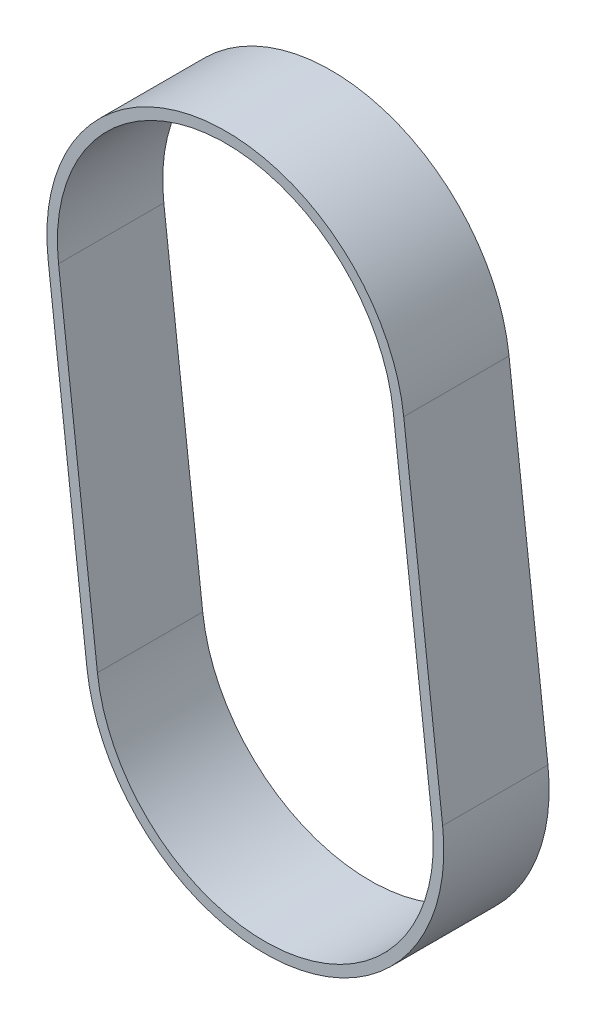
ISO-10303-21;
HEADER;
FILE_DESCRIPTION(('STEP AP214'),'2;1');
FILE_NAME('part.step','',(''),(''),'','','');
FILE_SCHEMA(('AUTOMOTIVE_DESIGN { 1 0 10303 214 1 1 1 1 }'));
ENDSEC;
DATA;
#1=APPLICATION_CONTEXT('core data for automotive mechanical design processes');
#2=APPLICATION_PROTOCOL_DEFINITION('international standard','automotive_design',2000,#1);
#3=PRODUCT_CONTEXT('',#1,'mechanical');
#4=PRODUCT('Part','Part','',(#3));
#5=PRODUCT_RELATED_PRODUCT_CATEGORY('part','',(#4));
#6=PRODUCT_DEFINITION_FORMATION('','',#4);
#7=PRODUCT_DEFINITION_CONTEXT('part definition',#1,'design');
#8=PRODUCT_DEFINITION('design','',#6,#7);
#9=PRODUCT_DEFINITION_SHAPE('','',#8);
#10=(LENGTH_UNIT() NAMED_UNIT(*) SI_UNIT(.MILLI.,.METRE.));
#11=(NAMED_UNIT(*) PLANE_ANGLE_UNIT() SI_UNIT($,.RADIAN.));
#12=(NAMED_UNIT(*) SI_UNIT($,.STERADIAN.) SOLID_ANGLE_UNIT());
#13=UNCERTAINTY_MEASURE_WITH_UNIT(LENGTH_MEASURE(1.E-05),#10,'distance_accuracy_value','');
#14=(GEOMETRIC_REPRESENTATION_CONTEXT(3) GLOBAL_UNCERTAINTY_ASSIGNED_CONTEXT((#13)) GLOBAL_UNIT_ASSIGNED_CONTEXT((#10,
#11,#12)) REPRESENTATION_CONTEXT('',''));
#15=CARTESIAN_POINT('',(0.,0.,0.));
#16=DIRECTION('',(0.,0.,1.));
#17=DIRECTION('',(1.,0.,0.));
#18=AXIS2_PLACEMENT_3D('',#15,#16,#17);
#19=CARTESIAN_POINT('',(550.233603989508,25.6899886030883,219.190394221551));
#20=DIRECTION('',(0.,0.,-1.));
#21=DIRECTION('',(0.993314481568456,0.115439770904089,0.));
#22=AXIS2_PLACEMENT_3D('',#19,#20,#21);
#23=PLANE('',#22);
#24=CARTESIAN_POINT('',(550.233603989508,25.6899886030883,219.190394221551));
#25=DIRECTION('',(0.,0.,-1.));
#26=DIRECTION('',(0.993314481568456,0.115439770904089,0.));
#27=AXIS2_PLACEMENT_3D('',#24,#25,#26);
#28=CIRCLE('',#27,17.);
#29=CARTESIAN_POINT('',(567.119950176171,27.6524647084578,219.190394221551));
#30=VERTEX_POINT('',#29);
#31=CARTESIAN_POINT('',(533.347257802844,23.7275124977188,219.190394221551));
#32=VERTEX_POINT('',#31);
#33=EDGE_CURVE('E141',#30,#32,#28,.T.);
#34=ORIENTED_EDGE('',*,*,#33,.T.);
#35=DIRECTION('',(-0.115439770904089,0.993314481568456,0.));
#36=VECTOR('',#35,1.);
#37=CARTESIAN_POINT('',(533.347257802844,23.7275124977188,219.190394221551));
#38=LINE('',#37,#36);
#39=CARTESIAN_POINT('',(529.653185133913,55.5135759079094,219.190394221551));
#40=VERTEX_POINT('',#39);
#41=EDGE_CURVE('E144',#32,#40,#38,.T.);
#42=ORIENTED_EDGE('',*,*,#41,.T.);
#43=CARTESIAN_POINT('',(546.539531320577,57.4760520132789,219.190394221551));
#44=DIRECTION('',(0.,0.,-1.));
#45=DIRECTION('',(0.993314481568456,0.115439770904089,0.));
#46=AXIS2_PLACEMENT_3D('',#43,#44,#45);
#47=CIRCLE('',#46,17.);
#48=CARTESIAN_POINT('',(563.425877507241,59.4385281186484,219.190394221551));
#49=VERTEX_POINT('',#48);
#50=EDGE_CURVE('E147',#40,#49,#47,.T.);
#51=ORIENTED_EDGE('',*,*,#50,.T.);
#52=DIRECTION('',(0.115439770904089,-0.993314481568456,0.));
#53=VECTOR('',#52,1.);
#54=CARTESIAN_POINT('',(563.425877507241,59.4385281186484,219.190394221551));
#55=LINE('',#54,#53);
#56=EDGE_CURVE('E149',#49,#30,#55,.T.);
#57=ORIENTED_EDGE('',*,*,#56,.T.);
#58=EDGE_LOOP('',(#34,#42,#51,#57));
#59=FACE_BOUND('',#58,.T.);
#60=DIRECTION('',(0.115439770904089,-0.993314481568456,0.));
#61=VECTOR('',#60,1.);
#62=CARTESIAN_POINT('',(562.432563025672,59.3230883477443,219.190394221551));
#63=LINE('',#62,#61);
#64=CARTESIAN_POINT('',(562.432563025672,59.3230883477443,219.190394221551));
#65=VERTEX_POINT('',#64);
#66=CARTESIAN_POINT('',(566.126635694603,27.5370249375537,219.190394221551));
#67=VERTEX_POINT('',#66);
#68=EDGE_CURVE('E113',#65,#67,#63,.T.);
#69=ORIENTED_EDGE('',*,*,#68,.F.);
#70=CARTESIAN_POINT('',(546.539531320577,57.4760520132789,219.190394221551));
#71=DIRECTION('',(0.,0.,-1.));
#72=DIRECTION('',(0.993314481568456,0.115439770904089,0.));
#73=AXIS2_PLACEMENT_3D('',#70,#71,#72);
#74=CIRCLE('',#73,16.);
#75=CARTESIAN_POINT('',(530.646499615482,55.6290156788135,219.190394221551));
#76=VERTEX_POINT('',#75);
#77=EDGE_CURVE('E105',#76,#65,#74,.T.);
#78=ORIENTED_EDGE('',*,*,#77,.F.);
#79=DIRECTION('',(-0.115439770904089,0.993314481568456,0.));
#80=VECTOR('',#79,1.);
#81=CARTESIAN_POINT('',(534.340572284412,23.8429522686228,219.190394221551));
#82=LINE('',#81,#80);
#83=CARTESIAN_POINT('',(534.340572284412,23.8429522686228,219.190394221551));
#84=VERTEX_POINT('',#83);
#85=EDGE_CURVE('E127',#84,#76,#82,.T.);
#86=ORIENTED_EDGE('',*,*,#85,.F.);
#87=CARTESIAN_POINT('',(550.233603989508,25.6899886030883,219.190394221551));
#88=DIRECTION('',(0.,0.,-1.));
#89=DIRECTION('',(0.993314481568456,0.115439770904089,0.));
#90=AXIS2_PLACEMENT_3D('',#87,#88,#89);
#91=CIRCLE('',#90,16.);
#92=EDGE_CURVE('E125',#67,#84,#91,.T.);
#93=ORIENTED_EDGE('',*,*,#92,.F.);
#94=EDGE_LOOP('',(#69,#78,#86,#93));
#95=FACE_BOUND('',#94,.T.);
#96=ADVANCED_FACE('F40',(#59,#95),#23,.T.);
#97=CARTESIAN_POINT('',(550.233603989508,25.6899886030883,229.190394221551));
#98=DIRECTION('',(0.,0.,-1.));
#99=DIRECTION('',(0.993314481568456,0.115439770904089,0.));
#100=AXIS2_PLACEMENT_3D('',#97,#98,#99);
#101=PLANE('',#100);
#102=CARTESIAN_POINT('',(550.233603989508,25.6899886030883,229.190394221551));
#103=DIRECTION('',(0.,0.,-1.));
#104=DIRECTION('',(0.993314481568456,0.115439770904089,0.));
#105=AXIS2_PLACEMENT_3D('',#102,#103,#104);
#106=CIRCLE('',#105,17.);
#107=CARTESIAN_POINT('',(567.119950176171,27.6524647084578,229.190394221551));
#108=VERTEX_POINT('',#107);
#109=CARTESIAN_POINT('',(533.347257802844,23.7275124977188,229.190394221551));
#110=VERTEX_POINT('',#109);
#111=EDGE_CURVE('E121',#108,#110,#106,.T.);
#112=ORIENTED_EDGE('',*,*,#111,.F.);
#113=DIRECTION('',(0.115439770904089,-0.993314481568456,0.));
#114=VECTOR('',#113,1.);
#115=CARTESIAN_POINT('',(563.425877507241,59.4385281186484,229.190394221551));
#116=LINE('',#115,#114);
#117=CARTESIAN_POINT('',(563.425877507241,59.4385281186484,229.190394221551));
#118=VERTEX_POINT('',#117);
#119=EDGE_CURVE('E145',#118,#108,#116,.T.);
#120=ORIENTED_EDGE('',*,*,#119,.F.);
#121=CARTESIAN_POINT('',(546.539531320577,57.4760520132789,229.190394221551));
#122=DIRECTION('',(0.,0.,-1.));
#123=DIRECTION('',(0.993314481568456,0.115439770904089,0.));
#124=AXIS2_PLACEMENT_3D('',#121,#122,#123);
#125=CIRCLE('',#124,17.);
#126=CARTESIAN_POINT('',(529.653185133913,55.5135759079094,229.190394221551));
#127=VERTEX_POINT('',#126);
#128=EDGE_CURVE('E156',#127,#118,#125,.T.);
#129=ORIENTED_EDGE('',*,*,#128,.F.);
#130=DIRECTION('',(-0.115439770904089,0.993314481568456,0.));
#131=VECTOR('',#130,1.);
#132=CARTESIAN_POINT('',(533.347257802844,23.7275124977188,229.190394221551));
#133=LINE('',#132,#131);
#134=EDGE_CURVE('E154',#110,#127,#133,.T.);
#135=ORIENTED_EDGE('',*,*,#134,.F.);
#136=EDGE_LOOP('',(#112,#120,#129,#135));
#137=FACE_BOUND('',#136,.T.);
#138=CARTESIAN_POINT('',(546.539531320577,57.4760520132789,229.190394221551));
#139=DIRECTION('',(0.,0.,-1.));
#140=DIRECTION('',(0.993314481568456,0.115439770904089,0.));
#141=AXIS2_PLACEMENT_3D('',#138,#139,#140);
#142=CIRCLE('',#141,16.);
#143=CARTESIAN_POINT('',(530.646499615482,55.6290156788135,229.190394221551));
#144=VERTEX_POINT('',#143);
#145=CARTESIAN_POINT('',(562.432563025672,59.3230883477443,229.190394221551));
#146=VERTEX_POINT('',#145);
#147=EDGE_CURVE('E63',#144,#146,#142,.T.);
#148=ORIENTED_EDGE('',*,*,#147,.T.);
#149=DIRECTION('',(0.115439770904089,-0.993314481568456,0.));
#150=VECTOR('',#149,1.);
#151=CARTESIAN_POINT('',(562.432563025672,59.3230883477443,229.190394221551));
#152=LINE('',#151,#150);
#153=CARTESIAN_POINT('',(566.126635694603,27.5370249375537,229.190394221551));
#154=VERTEX_POINT('',#153);
#155=EDGE_CURVE('E120',#146,#154,#152,.T.);
#156=ORIENTED_EDGE('',*,*,#155,.T.);
#157=CARTESIAN_POINT('',(550.233603989508,25.6899886030883,229.190394221551));
#158=DIRECTION('',(0.,0.,-1.));
#159=DIRECTION('',(0.993314481568456,0.115439770904089,0.));
#160=AXIS2_PLACEMENT_3D('',#157,#158,#159);
#161=CIRCLE('',#160,16.);
#162=CARTESIAN_POINT('',(534.340572284412,23.8429522686228,229.190394221551));
#163=VERTEX_POINT('',#162);
#164=EDGE_CURVE('E133',#154,#163,#161,.T.);
#165=ORIENTED_EDGE('',*,*,#164,.T.);
#166=DIRECTION('',(-0.115439770904089,0.993314481568456,0.));
#167=VECTOR('',#166,1.);
#168=CARTESIAN_POINT('',(534.340572284412,23.8429522686228,229.190394221551));
#169=LINE('',#168,#167);
#170=EDGE_CURVE('E114',#163,#144,#169,.T.);
#171=ORIENTED_EDGE('',*,*,#170,.T.);
#172=EDGE_LOOP('',(#148,#156,#165,#171));
#173=FACE_BOUND('',#172,.T.);
#174=ADVANCED_FACE('F174',(#137,#173),#101,.F.);
#175=CARTESIAN_POINT('',(550.233603989508,25.6899886030883,219.190394221551));
#176=DIRECTION('',(0.,0.,1.));
#177=DIRECTION('',(-0.993314481568456,-0.115439770904089,0.));
#178=AXIS2_PLACEMENT_3D('',#175,#176,#177);
#179=CYLINDRICAL_SURFACE('',#178,17.);
#180=ORIENTED_EDGE('',*,*,#111,.T.);
#181=DIRECTION('',(0.,0.,1.));
#182=VECTOR('',#181,1.);
#183=CARTESIAN_POINT('',(533.347257802844,23.7275124977188,219.190394221551));
#184=LINE('',#183,#182);
#185=EDGE_CURVE('E11',#32,#110,#184,.T.);
#186=ORIENTED_EDGE('',*,*,#185,.F.);
#187=ORIENTED_EDGE('',*,*,#33,.F.);
#188=DIRECTION('',(0.,0.,1.));
#189=VECTOR('',#188,1.);
#190=CARTESIAN_POINT('',(567.119950176171,27.6524647084578,219.190394221551));
#191=LINE('',#190,#189);
#192=EDGE_CURVE('E151',#30,#108,#191,.T.);
#193=ORIENTED_EDGE('',*,*,#192,.T.);
#194=EDGE_LOOP('',(#180,#186,#187,#193));
#195=FACE_BOUND('',#194,.T.);
#196=ADVANCED_FACE('F42',(#195),#179,.T.);
#197=CARTESIAN_POINT('',(533.347257802844,23.7275124977188,219.190394221551));
#198=DIRECTION('',(0.993314481568456,0.115439770904089,0.));
#199=DIRECTION('',(0.115439770904089,-0.993314481568456,0.));
#200=AXIS2_PLACEMENT_3D('',#197,#198,#199);
#201=PLANE('',#200);
#202=ORIENTED_EDGE('',*,*,#134,.T.);
#203=DIRECTION('',(0.,0.,1.));
#204=VECTOR('',#203,1.);
#205=CARTESIAN_POINT('',(529.653185133913,55.5135759079094,219.190394221551));
#206=LINE('',#205,#204);
#207=EDGE_CURVE('E48',#40,#127,#206,.T.);
#208=ORIENTED_EDGE('',*,*,#207,.F.);
#209=ORIENTED_EDGE('',*,*,#41,.F.);
#210=ORIENTED_EDGE('',*,*,#185,.T.);
#211=EDGE_LOOP('',(#202,#208,#209,#210));
#212=FACE_BOUND('',#211,.T.);
#213=ADVANCED_FACE('F184',(#212),#201,.F.);
#214=CARTESIAN_POINT('',(546.539531320577,57.4760520132789,219.190394221551));
#215=DIRECTION('',(0.,0.,1.));
#216=DIRECTION('',(-0.993314481568456,-0.115439770904089,0.));
#217=AXIS2_PLACEMENT_3D('',#214,#215,#216);
#218=CYLINDRICAL_SURFACE('',#217,17.);
#219=ORIENTED_EDGE('',*,*,#128,.T.);
#220=DIRECTION('',(0.,0.,1.));
#221=VECTOR('',#220,1.);
#222=CARTESIAN_POINT('',(563.425877507241,59.4385281186484,219.190394221551));
#223=LINE('',#222,#221);
#224=EDGE_CURVE('E161',#49,#118,#223,.T.);
#225=ORIENTED_EDGE('',*,*,#224,.F.);
#226=ORIENTED_EDGE('',*,*,#50,.F.);
#227=ORIENTED_EDGE('',*,*,#207,.T.);
#228=EDGE_LOOP('',(#219,#225,#226,#227));
#229=FACE_BOUND('',#228,.T.);
#230=ADVANCED_FACE('F168',(#229),#218,.T.);
#231=CARTESIAN_POINT('',(563.425877507241,59.4385281186484,219.190394221551));
#232=DIRECTION('',(-0.993314481568456,-0.115439770904089,0.));
#233=DIRECTION('',(-0.115439770904089,0.993314481568456,0.));
#234=AXIS2_PLACEMENT_3D('',#231,#232,#233);
#235=PLANE('',#234);
#236=ORIENTED_EDGE('',*,*,#119,.T.);
#237=ORIENTED_EDGE('',*,*,#192,.F.);
#238=ORIENTED_EDGE('',*,*,#56,.F.);
#239=ORIENTED_EDGE('',*,*,#224,.T.);
#240=EDGE_LOOP('',(#236,#237,#238,#239));
#241=FACE_BOUND('',#240,.T.);
#242=ADVANCED_FACE('F178',(#241),#235,.F.);
#243=CARTESIAN_POINT('',(546.539531320577,57.4760520132789,219.190394221551));
#244=DIRECTION('',(0.,0.,1.));
#245=DIRECTION('',(-0.993314481568456,-0.115439770904089,0.));
#246=AXIS2_PLACEMENT_3D('',#243,#244,#245);
#247=CYLINDRICAL_SURFACE('',#246,16.);
#248=ORIENTED_EDGE('',*,*,#147,.F.);
#249=DIRECTION('',(0.,0.,1.));
#250=VECTOR('',#249,1.);
#251=CARTESIAN_POINT('',(530.646499615482,55.6290156788135,219.190394221551));
#252=LINE('',#251,#250);
#253=EDGE_CURVE('E109',#76,#144,#252,.T.);
#254=ORIENTED_EDGE('',*,*,#253,.F.);
#255=ORIENTED_EDGE('',*,*,#77,.T.);
#256=DIRECTION('',(0.,0.,1.));
#257=VECTOR('',#256,1.);
#258=CARTESIAN_POINT('',(562.432563025672,59.3230883477443,219.190394221551));
#259=LINE('',#258,#257);
#260=EDGE_CURVE('E108',#65,#146,#259,.T.);
#261=ORIENTED_EDGE('',*,*,#260,.T.);
#262=EDGE_LOOP('',(#248,#254,#255,#261));
#263=FACE_BOUND('',#262,.T.);
#264=ADVANCED_FACE('F107',(#263),#247,.F.);
#265=CARTESIAN_POINT('',(562.432563025672,59.3230883477443,219.190394221551));
#266=DIRECTION('',(-0.993314481568456,-0.115439770904089,0.));
#267=DIRECTION('',(-0.115439770904089,0.993314481568456,0.));
#268=AXIS2_PLACEMENT_3D('',#265,#266,#267);
#269=PLANE('',#268);
#270=ORIENTED_EDGE('',*,*,#155,.F.);
#271=ORIENTED_EDGE('',*,*,#260,.F.);
#272=ORIENTED_EDGE('',*,*,#68,.T.);
#273=DIRECTION('',(0.,0.,1.));
#274=VECTOR('',#273,1.);
#275=CARTESIAN_POINT('',(566.126635694603,27.5370249375537,219.190394221551));
#276=LINE('',#275,#274);
#277=EDGE_CURVE('E122',#67,#154,#276,.T.);
#278=ORIENTED_EDGE('',*,*,#277,.T.);
#279=EDGE_LOOP('',(#270,#271,#272,#278));
#280=FACE_BOUND('',#279,.T.);
#281=ADVANCED_FACE('F117',(#280),#269,.T.);
#282=CARTESIAN_POINT('',(550.233603989508,25.6899886030883,219.190394221551));
#283=DIRECTION('',(0.,0.,1.));
#284=DIRECTION('',(-0.993314481568456,-0.115439770904089,0.));
#285=AXIS2_PLACEMENT_3D('',#282,#283,#284);
#286=CYLINDRICAL_SURFACE('',#285,16.);
#287=ORIENTED_EDGE('',*,*,#164,.F.);
#288=ORIENTED_EDGE('',*,*,#277,.F.);
#289=ORIENTED_EDGE('',*,*,#92,.T.);
#290=DIRECTION('',(0.,0.,1.));
#291=VECTOR('',#290,1.);
#292=CARTESIAN_POINT('',(534.340572284412,23.8429522686228,219.190394221551));
#293=LINE('',#292,#291);
#294=EDGE_CURVE('E55',#84,#163,#293,.T.);
#295=ORIENTED_EDGE('',*,*,#294,.T.);
#296=EDGE_LOOP('',(#287,#288,#289,#295));
#297=FACE_BOUND('',#296,.T.);
#298=ADVANCED_FACE('F207',(#297),#286,.F.);
#299=CARTESIAN_POINT('',(534.340572284412,23.8429522686228,219.190394221551));
#300=DIRECTION('',(0.993314481568456,0.115439770904089,0.));
#301=DIRECTION('',(0.115439770904089,-0.993314481568456,0.));
#302=AXIS2_PLACEMENT_3D('',#299,#300,#301);
#303=PLANE('',#302);
#304=ORIENTED_EDGE('',*,*,#170,.F.);
#305=ORIENTED_EDGE('',*,*,#294,.F.);
#306=ORIENTED_EDGE('',*,*,#85,.T.);
#307=ORIENTED_EDGE('',*,*,#253,.T.);
#308=EDGE_LOOP('',(#304,#305,#306,#307));
#309=FACE_BOUND('',#308,.T.);
#310=ADVANCED_FACE('F211',(#309),#303,.T.);
#311=CLOSED_SHELL('',(#96,#174,#196,#213,#230,#242,#264,#281,#298,#310));
#312=MANIFOLD_SOLID_BREP('B2',#311);
#313=ADVANCED_BREP_SHAPE_REPRESENTATION('',(#18,#312),#14);
#314=SHAPE_DEFINITION_REPRESENTATION(#9,#313);
ENDSEC;
END-ISO-10303-21;
